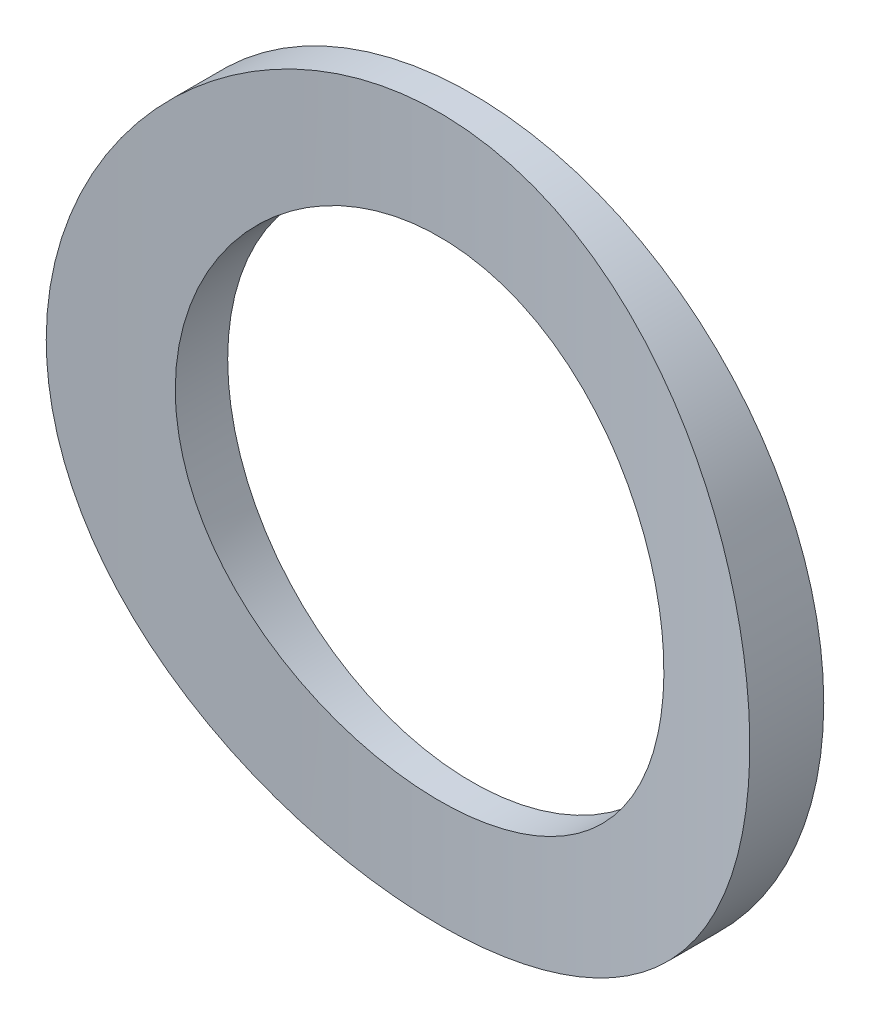
ISO-10303-21;
HEADER;
FILE_DESCRIPTION(('STEP AP214'),'2;1');
FILE_NAME('part.step','',(''),(''),'','','');
FILE_SCHEMA(('AUTOMOTIVE_DESIGN { 1 0 10303 214 1 1 1 1 }'));
ENDSEC;
DATA;
#1=APPLICATION_CONTEXT('core data for automotive mechanical design processes');
#2=APPLICATION_PROTOCOL_DEFINITION('international standard','automotive_design',2000,#1);
#3=PRODUCT_CONTEXT('',#1,'mechanical');
#4=PRODUCT('Part','Part','',(#3));
#5=PRODUCT_RELATED_PRODUCT_CATEGORY('part','',(#4));
#6=PRODUCT_DEFINITION_FORMATION('','',#4);
#7=PRODUCT_DEFINITION_CONTEXT('part definition',#1,'design');
#8=PRODUCT_DEFINITION('design','',#6,#7);
#9=PRODUCT_DEFINITION_SHAPE('','',#8);
#10=(LENGTH_UNIT() NAMED_UNIT(*) SI_UNIT(.MILLI.,.METRE.));
#11=(NAMED_UNIT(*) PLANE_ANGLE_UNIT() SI_UNIT($,.RADIAN.));
#12=(NAMED_UNIT(*) SI_UNIT($,.STERADIAN.) SOLID_ANGLE_UNIT());
#13=UNCERTAINTY_MEASURE_WITH_UNIT(LENGTH_MEASURE(1.E-05),#10,'distance_accuracy_value','');
#14=(GEOMETRIC_REPRESENTATION_CONTEXT(3) GLOBAL_UNCERTAINTY_ASSIGNED_CONTEXT((#13)) GLOBAL_UNIT_ASSIGNED_CONTEXT((#10,
#11,#12)) REPRESENTATION_CONTEXT('',''));
#15=CARTESIAN_POINT('',(0.,0.,0.));
#16=DIRECTION('',(0.,0.,1.));
#17=DIRECTION('',(1.,0.,0.));
#18=AXIS2_PLACEMENT_3D('',#15,#16,#17);
#19=CARTESIAN_POINT('',(0.,0.,0.));
#20=DIRECTION('',(0.,0.,1.));
#21=DIRECTION('',(1.,0.,0.));
#22=AXIS2_PLACEMENT_3D('',#19,#20,#21);
#23=PLANE('',#22);
#24=CARTESIAN_POINT('',(0.,0.,0.));
#25=DIRECTION('',(0.,0.,1.));
#26=DIRECTION('',(1.,0.,0.));
#27=AXIS2_PLACEMENT_3D('',#24,#25,#26);
#28=CIRCLE('',#27,10.8);
#29=CARTESIAN_POINT('',(10.8,0.,0.));
#30=VERTEX_POINT('',#29);
#31=EDGE_CURVE('E10',#30,#30,#28,.T.);
#32=ORIENTED_EDGE('',*,*,#31,.F.);
#33=EDGE_LOOP('',(#32));
#34=FACE_BOUND('',#33,.T.);
#35=CARTESIAN_POINT('',(0.,0.,0.));
#36=DIRECTION('',(0.,0.,1.));
#37=DIRECTION('',(1.,0.,0.));
#38=AXIS2_PLACEMENT_3D('',#35,#36,#37);
#39=CIRCLE('',#38,7.5);
#40=CARTESIAN_POINT('',(7.5,0.,0.));
#41=VERTEX_POINT('',#40);
#42=EDGE_CURVE('E45',#41,#41,#39,.T.);
#43=ORIENTED_EDGE('',*,*,#42,.T.);
#44=EDGE_LOOP('',(#43));
#45=FACE_BOUND('',#44,.T.);
#46=ADVANCED_FACE('F31',(#34,#45),#23,.F.);
#47=CARTESIAN_POINT('',(0.,0.,30.));
#48=DIRECTION('',(0.,0.,-1.));
#49=DIRECTION('',(-1.,0.,0.));
#50=AXIS2_PLACEMENT_3D('',#47,#48,#49);
#51=CYLINDRICAL_SURFACE('',#50,10.8);
#52=CARTESIAN_POINT('',(-10.8,0.,2.27073685973223));
#53=CARTESIAN_POINT('',(-10.8000077639499,0.299001355064548,2.27074173485695));
#54=CARTESIAN_POINT('',(-10.7875806288362,0.597913848239931,2.26776868920434));
#55=CARTESIAN_POINT('',(-10.7379924634883,1.19365056032112,2.25597722948887));
#56=CARTESIAN_POINT('',(-10.7008280778157,1.49047449040715,2.24715802243497));
#57=CARTESIAN_POINT('',(-10.6020355743017,2.07995969588069,2.22392653979849));
#58=CARTESIAN_POINT('',(-10.5403934990447,2.37261849747889,2.20951107327967));
#59=CARTESIAN_POINT('',(-10.3931508046333,2.95154555763004,2.17551816349824));
#60=CARTESIAN_POINT('',(-10.3075496318456,3.23781366834545,2.15594060095345));
#61=CARTESIAN_POINT('',(-10.1131844935509,3.8016193982467,2.11222486629569));
#62=CARTESIAN_POINT('',(-10.0044487912071,4.07916720032196,2.08809226304185));
#63=CARTESIAN_POINT('',(-9.76457767262258,4.6240271944064,2.03594569402156));
#64=CARTESIAN_POINT('',(-9.63344210524146,4.89133931733662,2.00793170206613));
#65=CARTESIAN_POINT('',(-9.34975164690604,5.413919290342,1.94881942597762));
#66=CARTESIAN_POINT('',(-9.19720070235002,5.66918934796009,1.9177217104185));
#67=CARTESIAN_POINT('',(-8.87167256651769,6.16617371385794,1.85328980358992));
#68=CARTESIAN_POINT('',(-8.69868862738671,6.4078835048667,1.81995487507465));
#69=CARTESIAN_POINT('',(-8.33040148872024,6.88008530329421,1.75139173384846));
#70=CARTESIAN_POINT('',(-8.13476988222033,7.11031796814008,1.71614101672734));
#71=CARTESIAN_POINT('',(-7.72494638698721,7.55356282311963,1.64526030330282));
#72=CARTESIAN_POINT('',(-7.5107543275332,7.76657485482147,1.60963030351338));
#73=CARTESIAN_POINT('',(-7.06517177307179,8.17401416550872,1.53896682166821));
#74=CARTESIAN_POINT('',(-6.83377682753116,8.36843660525884,1.50393349687881));
#75=CARTESIAN_POINT('',(-6.35544637869229,8.73724640441633,1.43544996569935));
#76=CARTESIAN_POINT('',(-6.10851635390818,8.91164076619035,1.40199920842029));
#77=CARTESIAN_POINT('',(-5.59759039681111,9.24123994407877,1.33719775122637));
#78=CARTESIAN_POINT('',(-5.33342379114506,9.39618633874338,1.30587744590513));
#79=CARTESIAN_POINT('',(-4.79257862951301,9.68322861499183,1.24667596206648));
#80=CARTESIAN_POINT('',(-4.51589994343713,9.81532425888771,1.21879481932327));
#81=CARTESIAN_POINT('',(-3.95200211876164,10.0556252571342,1.16727014628905));
#82=CARTESIAN_POINT('',(-3.66478401485985,10.1638329493838,1.14362620134878));
#83=CARTESIAN_POINT('',(-3.0818520701601,10.3554969991431,1.10125379368034));
#84=CARTESIAN_POINT('',(-2.78613839843994,10.4389538488674,1.08252523320184));
#85=CARTESIAN_POINT('',(-2.19364856046447,10.5791752518373,1.05080825232496));
#86=CARTESIAN_POINT('',(-1.89698233982591,10.6363830030558,1.03772476399887));
#87=CARTESIAN_POINT('',(-1.29970821189884,10.7257603705992,1.01719596870116));
#88=CARTESIAN_POINT('',(-0.999100346340561,10.7579302517831,1.00975060208765));
#89=CARTESIAN_POINT('',(-0.39619185150779,10.7969568897382,1.00071012076971));
#90=CARTESIAN_POINT('',(-0.0938914154250195,10.8038164787512,0.999114351490847));
#91=CARTESIAN_POINT('',(0.510192286693852,10.7921714260572,1.00181680734435));
#92=CARTESIAN_POINT('',(0.811975558189172,10.7736670537656,1.0061149698715));
#93=CARTESIAN_POINT('',(1.4070249154036,10.7120507666735,1.02034446740681));
#94=CARTESIAN_POINT('',(1.70034334894591,10.6694175826488,1.03016618824462));
#95=CARTESIAN_POINT('',(2.28226432163627,10.5602511887253,1.05509296166088));
#96=CARTESIAN_POINT('',(2.57086693119371,10.493718336001,1.07019793528238));
#97=CARTESIAN_POINT('',(3.1413676121023,10.3372772360708,1.10528249033795));
#98=CARTESIAN_POINT('',(3.42326547614662,10.2473682671119,1.12526222228223));
#99=CARTESIAN_POINT('',(3.97843958455759,10.0448657694457,1.16955916960642));
#100=CARTESIAN_POINT('',(4.25171572067711,9.9322719560576,1.19387643941931));
#101=CARTESIAN_POINT('',(4.7899411414532,9.68426307355597,1.24640619014612));
#102=CARTESIAN_POINT('',(5.05480820518093,9.54867577055802,1.27464775420484));
#103=CARTESIAN_POINT('',(5.57230079550226,9.25623194795598,1.33413184115315));
#104=CARTESIAN_POINT('',(5.82492172599082,9.09936752543654,1.3653754778328));
#105=CARTESIAN_POINT('',(6.31612038327397,8.76554491510718,1.43001214795264));
#106=CARTESIAN_POINT('',(6.55470200235186,8.58859233680415,1.46340458023083));
#107=CARTESIAN_POINT('',(7.01648308314049,8.21566115439298,1.53147425328785));
#108=CARTESIAN_POINT('',(7.23967543823556,8.01967385952755,1.56615207643233));
#109=CARTESIAN_POINT('',(7.67417170073386,7.60521691313389,1.6366718844354));
#110=CARTESIAN_POINT('',(7.885074768365,7.38632822782758,1.67252211346239));
#111=CARTESIAN_POINT('',(8.28764619645418,6.93160097336108,1.74356539589387));
#112=CARTESIAN_POINT('',(8.47932293461083,6.69576986426533,1.77875873004543));
#113=CARTESIAN_POINT('',(8.84231396283838,6.2085276838628,1.84752486648222));
#114=CARTESIAN_POINT('',(9.01361881299769,5.95710947127149,1.88109691325011));
#115=CARTESIAN_POINT('',(9.33448162170863,5.4405749625447,1.94562620578148));
#116=CARTESIAN_POINT('',(9.4840480484064,5.17546405520439,1.97658446775773));
#117=CARTESIAN_POINT('',(9.76094860294546,4.63219138736338,2.03511129600823));
#118=CARTESIAN_POINT('',(9.88819356023803,4.35398267186326,2.06266614215835));
#119=CARTESIAN_POINT('',(10.1187422165277,3.78742511944371,2.11341822461911));
#120=CARTESIAN_POINT('',(10.2220457927394,3.49907623052823,2.13661543858114));
#121=CARTESIAN_POINT('',(10.403858304161,2.91435344383571,2.17794015685011));
#122=CARTESIAN_POINT('',(10.4823709170877,2.61798074347312,2.19606841308657));
#123=CARTESIAN_POINT('',(10.6139582928952,2.01935619320439,2.22669589501808));
#124=CARTESIAN_POINT('',(10.6670336239601,1.7171044747729,2.23919524644376));
#125=CARTESIAN_POINT('',(10.7463683867706,1.11596161352194,2.2579546698654));
#126=CARTESIAN_POINT('',(10.7732139459164,0.817151964280564,2.26435103788478));
#127=CARTESIAN_POINT('',(10.8019547382571,0.21826884368453,2.27120090385383));
#128=CARTESIAN_POINT('',(10.8038503502968,-0.0818046084110967,2.2716544920398));
#129=CARTESIAN_POINT('',(10.7826763638089,-0.680995772700239,2.26660522187478));
#130=CARTESIAN_POINT('',(10.7596085766466,-0.980113552658702,2.26110279569722));
#131=CARTESIAN_POINT('',(10.688706152298,-1.57523285989396,2.24430927363718));
#132=CARTESIAN_POINT('',(10.6408716002498,-1.87123439787956,2.23301819765375));
#133=CARTESIAN_POINT('',(10.521657118881,-2.45397020749674,2.20517990454867));
#134=CARTESIAN_POINT('',(10.4506082967894,-2.74077586345949,2.18870671670118));
#135=CARTESIAN_POINT('',(10.2853671547845,-3.30730830193704,2.15093767291708));
#136=CARTESIAN_POINT('',(10.1911751060527,-3.58703516735545,2.12964187348981));
#137=CARTESIAN_POINT('',(9.98037324428892,-4.13751253138689,2.0828362167096));
#138=CARTESIAN_POINT('',(9.86376542815623,-4.40826382706768,2.05732673475928));
#139=CARTESIAN_POINT('',(9.60893418676102,-4.93914061054789,2.00279650866618));
#140=CARTESIAN_POINT('',(9.47070309833926,-5.19926228989697,1.9737745205404));
#141=CARTESIAN_POINT('',(9.17109819416883,-5.71143289851947,1.91250749635933));
#142=CARTESIAN_POINT('',(9.00937123497992,-5.96326972224196,1.88021609636413));
#143=CARTESIAN_POINT('',(8.66571666953107,-6.4524971718311,1.8137351350688));
#144=CARTESIAN_POINT('',(8.48378868091327,-6.6898875241284,1.77954553784639));
#145=CARTESIAN_POINT('',(8.10090164085614,-7.14875572360928,1.710199209557));
#146=CARTESIAN_POINT('',(7.89993708861617,-7.37022893866756,1.67504220104207));
#147=CARTESIAN_POINT('',(7.48041176688554,-7.79568247777986,1.60473951038025));
#148=CARTESIAN_POINT('',(7.26185685249643,-7.99966857626292,1.56959382834207));
#149=CARTESIAN_POINT('',(6.80363948670826,-8.39306925401438,1.49950751174856));
#150=CARTESIAN_POINT('',(6.5636249738233,-8.58207769298749,1.46458742600922));
#151=CARTESIAN_POINT('',(6.06826033438221,-8.93920860569443,1.39671912576174));
#152=CARTESIAN_POINT('',(5.81290996466278,-9.10733074812815,1.36377094253637));
#153=CARTESIAN_POINT('',(5.28861646315812,-9.42146065805262,1.30077618740398));
#154=CARTESIAN_POINT('',(5.0196737488114,-9.56746910413389,1.27072952646983));
#155=CARTESIAN_POINT('',(4.4700488393126,-9.83627190631416,1.21438853895161));
#156=CARTESIAN_POINT('',(4.18936679811181,-9.95906656672574,1.18809416317944));
#157=CARTESIAN_POINT('',(3.62020509007169,-10.1797166971282,1.14017345303671));
#158=CARTESIAN_POINT('',(3.33179210643366,-10.2777374367694,1.11851633970043));
#159=CARTESIAN_POINT('',(2.74740320716056,-10.4491384575663,1.08025932883062));
#160=CARTESIAN_POINT('',(2.45142730800213,-10.5225187923991,1.06365942028042));
#161=CARTESIAN_POINT('',(1.85412052524956,-10.6440174820748,1.0359949591215));
#162=CARTESIAN_POINT('',(1.55279038424757,-10.692139312238,1.02492964501726));
#163=CARTESIAN_POINT('',(0.94698446975415,-10.7627232060693,1.00865085127562));
#164=CARTESIAN_POINT('',(0.64250875470349,-10.7851857455925,1.00343726311718));
#165=CARTESIAN_POINT('',(0.0398432814240538,-10.8040348604173,0.999064134811235));
#166=CARTESIAN_POINT('',(-0.258326946408867,-10.801019008931,0.99976585545011));
#167=CARTESIAN_POINT('',(-0.853325982441433,-10.7703561851977,1.00687403452547));
#168=CARTESIAN_POINT('',(-1.15015481289775,-10.7427096231466,1.01328039795775));
#169=CARTESIAN_POINT('',(-1.74033440604452,-10.6630155940839,1.03162044019156));
#170=CARTESIAN_POINT('',(-2.03368526543595,-10.6109688071315,1.04355396494537));
#171=CARTESIAN_POINT('',(-2.61484116715757,-10.4828976474921,1.07261997863682));
#172=CARTESIAN_POINT('',(-2.9026461853381,-10.406873170418,1.0897524902083));
#173=CARTESIAN_POINT('',(-3.46954986514981,-10.231806994261,1.12866889999212));
#174=CARTESIAN_POINT('',(-3.74867922770274,-10.1328603591127,1.1504335580266));
#175=CARTESIAN_POINT('',(-4.29757077324849,-9.91253464627897,1.19807060180087));
#176=CARTESIAN_POINT('',(-4.56733300618388,-9.79115568821741,1.22394296563558));
#177=CARTESIAN_POINT('',(-5.09569261012037,-9.52686532689198,1.27910410254422));
#178=CARTESIAN_POINT('',(-5.35429108236778,-9.38395605375353,1.30839253758073));
#179=CARTESIAN_POINT('',(-5.85878409812715,-9.07754293770508,1.36962575052546));
#180=CARTESIAN_POINT('',(-6.10467376346153,-8.91403126830648,1.4015715363391));
#181=CARTESIAN_POINT('',(-6.58702894054109,-8.56397547126851,1.46795006381996));
#182=CARTESIAN_POINT('',(-6.82319443338545,-8.37702498539523,1.50242057191657));
#183=CARTESIAN_POINT('',(-7.2791181395949,-7.98405016617387,1.57231767317527));
#184=CARTESIAN_POINT('',(-7.49886881138631,-7.77801716180381,1.60774469574229));
#185=CARTESIAN_POINT('',(-7.9204540320696,-7.34826734742555,1.67857670816378));
#186=CARTESIAN_POINT('',(-8.12228424747045,-7.12454628471618,1.71398169064434));
#187=CARTESIAN_POINT('',(-8.50653654650244,-6.66103745404264,1.78376670422447));
#188=CARTESIAN_POINT('',(-8.68896725300596,-6.42125690224647,1.81814718577099));
#189=CARTESIAN_POINT('',(-9.03602461915932,-5.92316232107334,1.88547224134056));
#190=CARTESIAN_POINT('',(-9.20032108478571,-5.66461377168659,1.91838518667168));
#191=CARTESIAN_POINT('',(-9.50644212531237,-5.13432183367143,1.98120339364239));
#192=CARTESIAN_POINT('',(-9.64827508425109,-4.86258341759471,2.01110977588998));
#193=CARTESIAN_POINT('',(-9.90840033447303,-4.30782805727641,2.06702364321712));
#194=CARTESIAN_POINT('',(-10.0267044935464,-4.02481688585461,2.09303309224584));
#195=CARTESIAN_POINT('',(-10.238895010355,-3.44950426917343,2.14037896803993));
#196=CARTESIAN_POINT('',(-10.332785480953,-3.1572043980621,2.16171618181975));
#197=CARTESIAN_POINT('',(-10.5417658985946,-2.39649048078917,2.20970004636744));
#198=CARTESIAN_POINT('',(-10.6384487404986,-1.92263358242326,2.23244376273321));
#199=CARTESIAN_POINT('',(-10.7675575287576,-0.965773522841456,2.26295776891854));
#200=CARTESIAN_POINT('',(-10.7999874642396,-0.482770931313611,2.27072898830135));
#201=CARTESIAN_POINT('',(-10.8,0.,2.27073685973223));
#202=B_SPLINE_CURVE_WITH_KNOTS('',3,(#52,#53,#54,#55,#56,#57,#58,#59,#60,#61,#62,#63,#64,#65,
#66,#67,#68,#69,#70,#71,#72,#73,#74,#75,#76,#77,#78,#79,#80,#81,#82,#83,#84,#85,#86,#87,#88,#89,
#90,#91,#92,#93,#94,#95,#96,#97,#98,#99,#100,#101,#102,#103,#104,#105,#106,#107,#108,#109,#110,
#111,#112,#113,#114,#115,#116,#117,#118,#119,#120,#121,#122,#123,#124,#125,#126,#127,#128,#129,
#130,#131,#132,#133,#134,#135,#136,#137,#138,#139,#140,#141,#142,#143,#144,#145,#146,#147,#148,
#149,#150,#151,#152,#153,#154,#155,#156,#157,#158,#159,#160,#161,#162,#163,#164,#165,#166,#167,
#168,#169,#170,#171,#172,#173,#174,#175,#176,#177,#178,#179,#180,#181,#182,#183,#184,#185,#186,
#187,#188,#189,#190,#191,#192,#193,#194,#195,#196,#197,#198,#199,#200,#201),.UNSPECIFIED.,.T.,
.F.,(4,2,2,2,2,2,2,2,2,2,2,2,2,2,2,2,2,2,2,2,2,2,2,2,2,2,2,2,2,2,2,2,2,2,2,2,2,2,2,2,2,2,2,2,2,
2,2,2,2,2,2,2,2,2,2,2,2,2,2,2,2,2,2,2,2,2,2,2,2,2,2,2,2,2,4),(0.,0.896578405721219,
1.79327845094476,2.69049053912472,3.58772336128606,4.48386627578531,5.38001523714484,
6.27599927357424,7.17228003415443,8.08374154655448,8.99521144355307,9.90691797169745,
10.8183047654578,11.7407463858677,12.6631976007148,13.5855584957716,14.50790104681,
15.4140388986039,16.3201671648391,17.2261940315266,18.1322112744914,19.020852865191,
19.9094811759218,20.7981369268981,21.6868038306505,22.5824478391688,23.4784254304734,
24.374153437566,25.2702923507597,26.1874185213981,27.1041433105711,28.0212912493796,
28.9380809524958,29.8584535668097,30.778830901232,31.6990716343004,32.619291811293,
33.5184436051873,34.4175817461714,35.3166546493076,36.2157244618151,37.1024930243816,
37.9892511967036,38.8759304091198,39.7629245702776,40.6649815641894,41.5670556348243,
42.4693911683586,43.3714275842252,44.2928021095853,45.2141912479958,46.1355521065269,
47.0569008859796,47.9719305808206,48.8869582823377,49.8018600520804,50.7167448545665,
51.6102324944427,52.503705254598,53.3971531142383,54.2906048635669,55.1804155580846,
56.0702215076843,56.9599394810943,57.8499964675569,58.75845845339,59.6673352852251,
60.5764313047485,61.4851215368259,62.4082980172299,63.3311291250223,64.2534935750377,
65.1757025376969,66.6234179409925,68.0710434603894),.UNSPECIFIED.);
#203=CARTESIAN_POINT('',(-10.8,0.,2.27073685973223));
#204=VERTEX_POINT('',#203);
#205=EDGE_CURVE('E49',#204,#204,#202,.T.);
#206=ORIENTED_EDGE('',*,*,#205,.T.);
#207=EDGE_LOOP('',(#206));
#208=FACE_BOUND('',#207,.T.);
#209=ORIENTED_EDGE('',*,*,#31,.T.);
#210=EDGE_LOOP('',(#209));
#211=FACE_BOUND('',#210,.T.);
#212=ADVANCED_FACE('F33',(#208,#211),#51,.T.);
#213=CARTESIAN_POINT('',(0.,0.,30.));
#214=DIRECTION('',(0.,0.,-1.));
#215=DIRECTION('',(-1.,0.,0.));
#216=AXIS2_PLACEMENT_3D('',#213,#214,#215);
#217=CYLINDRICAL_SURFACE('',#216,7.5);
#218=CARTESIAN_POINT('',(-7.5,0.,1.60842663845237));
#219=CARTESIAN_POINT('',(-7.50000310004231,0.209237951355892,1.60842800898571));
#220=CARTESIAN_POINT('',(-7.49124110676116,0.418433500386381,1.6069937772954));
#221=CARTESIAN_POINT('',(-7.45626487777193,0.835386596699285,1.60130147611473));
#222=CARTESIAN_POINT('',(-7.43004711016824,1.04314384436721,1.59704283515119));
#223=CARTESIAN_POINT('',(-7.36033143969776,1.45579640713422,1.58582017015627));
#224=CARTESIAN_POINT('',(-7.31682231470485,1.66068977399716,1.57885438925059));
#225=CARTESIAN_POINT('',(-7.21283756659006,2.06610291384546,1.56241746605274));
#226=CARTESIAN_POINT('',(-7.15235571556807,2.2666210522401,1.55294540418947));
#227=CARTESIAN_POINT('',(-7.01496772818524,2.66155776946498,1.53178321018825));
#228=CARTESIAN_POINT('',(-6.93808125445849,2.85598333370477,1.52009573530652));
#229=CARTESIAN_POINT('',(-6.76837429397757,3.2377081833336,1.4948246770211));
#230=CARTESIAN_POINT('',(-6.67554793475428,3.42500481114742,1.48124039515396));
#231=CARTESIAN_POINT('',(-6.47469886519898,3.79101965602639,1.45257109618812));
#232=CARTESIAN_POINT('',(-6.36668380888356,3.96974213338235,1.4374868360854));
#233=CARTESIAN_POINT('',(-6.13614000914509,4.31756120255392,1.4062293709947));
#234=CARTESIAN_POINT('',(-6.01360587234313,4.48665418256367,1.39005576231708));
#235=CARTESIAN_POINT('',(-5.75388205393554,4.81529349568494,1.35694499668998));
#236=CARTESIAN_POINT('',(-5.61658435085905,4.97475396281579,1.34000282149732));
#237=CARTESIAN_POINT('',(-5.32903802376743,5.28162701871979,1.30594548270838));
#238=CARTESIAN_POINT('',(-5.17878462417377,5.42903512554874,1.28883025739415));
#239=CARTESIAN_POINT('',(-4.86645216374103,5.71067842010067,1.25491810004372));
#240=CARTESIAN_POINT('',(-4.70437677141312,5.84491766421994,1.23812107128817));
#241=CARTESIAN_POINT('',(-4.36940872433828,6.09938712019816,1.20530364772709));
#242=CARTESIAN_POINT('',(-4.19651210341498,6.21961214883118,1.18928354154135));
#243=CARTESIAN_POINT('',(-3.84018309784239,6.44575525699546,1.15839186728666));
#244=CARTESIAN_POINT('',(-3.65669885223262,6.55159255613364,1.1435269699185));
#245=CARTESIAN_POINT('',(-3.2813340984787,6.74741863924646,1.11546388267449));
#246=CARTESIAN_POINT('',(-3.0894535176413,6.83740728597379,1.10226570723252));
#247=CARTESIAN_POINT('',(-2.69866596019677,7.00086113571623,1.07791262546506));
#248=CARTESIAN_POINT('',(-2.49975941090208,7.07432734161463,1.06675759513186));
#249=CARTESIAN_POINT('',(-2.09632895752328,7.20418699670608,1.04680852109991));
#250=CARTESIAN_POINT('',(-1.89180497525732,7.26058020815052,1.03801451027955));
#251=CARTESIAN_POINT('',(-1.48044821477849,7.35543538990898,1.02310640053227));
#252=CARTESIAN_POINT('',(-1.27365176529438,7.39405128343834,1.01696932553996));
#253=CARTESIAN_POINT('',(-0.857414992491751,7.45379551278308,1.00743450565046));
#254=CARTESIAN_POINT('',(-0.647973780827537,7.47491780503055,1.00403770745558));
#255=CARTESIAN_POINT('',(-0.228103341470235,7.49947663693933,1.00008612709181));
#256=CARTESIAN_POINT('',(-0.0176745630749211,7.50292056118977,0.999530158255136));
#257=CARTESIAN_POINT('',(0.402738924883321,7.49213614077099,1.00126650568137));
#258=CARTESIAN_POINT('',(0.612723442564314,7.47790129319955,1.00355987003391));
#259=CARTESIAN_POINT('',(1.23567702723121,7.4091901382021,1.01457793325708));
#260=CARTESIAN_POINT('',(1.6460463624496,7.32895691244866,1.02740144898877));
#261=CARTESIAN_POINT('',(2.44719093407735,7.1017536885861,1.06266250453943));
#262=CARTESIAN_POINT('',(2.83796560400835,6.9547817623065,1.08510032212741));
#263=CARTESIAN_POINT('',(3.5910650250218,6.59761903950575,1.13723938945999));
#264=CARTESIAN_POINT('',(3.95325988641284,6.38715847748296,1.16697153033906));
#265=CARTESIAN_POINT('',(4.63742119066314,5.9091905189663,1.23039415180955));
#266=CARTESIAN_POINT('',(4.95938458070221,5.64167879751471,1.26408493241216));
#267=CARTESIAN_POINT('',(5.55780154004595,5.05359202057368,1.33212533607814));
#268=CARTESIAN_POINT('',(5.8336970737303,4.73244913728612,1.36647809682667));
#269=CARTESIAN_POINT('',(6.32777266974111,4.04813476577568,1.43159988867525));
#270=CARTESIAN_POINT('',(6.54595226419974,3.68496293688413,1.46236889072282));
#271=CARTESIAN_POINT('',(6.91850222578428,2.92627487637723,1.51684013919002));
#272=CARTESIAN_POINT('',(7.0728087476292,2.5307267531669,1.54053530829253));
#273=CARTESIAN_POINT('',(7.31263602420977,1.71885895863071,1.5780562890935));
#274=CARTESIAN_POINT('',(7.39816242088142,1.30254099400136,1.59188291028447));
#275=CARTESIAN_POINT('',(7.49722322877017,0.465935337878749,1.60794571041301));
#276=CARTESIAN_POINT('',(7.51155168543268,0.0457440389728116,1.61030972057218));
#277=CARTESIAN_POINT('',(7.46992155580746,-0.791035608138519,1.60351964872926));
#278=CARTESIAN_POINT('',(7.41396550160588,-1.2076240855956,1.59436598166565));
#279=CARTESIAN_POINT('',(7.23403515934158,-2.0228684847523,1.56569017611544));
#280=CARTESIAN_POINT('',(7.11046210846825,-2.42161532419862,1.54622922238278));
#281=CARTESIAN_POINT('',(6.79920815403392,-3.19274779078062,1.49918131817801));
#282=CARTESIAN_POINT('',(6.61152364007083,-3.56513193188923,1.47159391008111));
#283=CARTESIAN_POINT('',(6.1755526496068,-4.27646833839519,1.4111080072606));
#284=CARTESIAN_POINT('',(5.9267560063621,-4.61510355341396,1.37816563556119));
#285=CARTESIAN_POINT('',(5.37608704649669,-5.24622185909425,1.31079269574547));
#286=CARTESIAN_POINT('',(5.07421124707305,-5.53870191888198,1.27636203008623));
#287=CARTESIAN_POINT('',(4.58666753875807,-5.93779344670591,1.22632218405291));
#288=CARTESIAN_POINT('',(4.41737272911676,-6.06478529203406,1.20982680048067));
#289=CARTESIAN_POINT('',(4.06861316953476,-6.30404825776702,1.17789232021576));
#290=CARTESIAN_POINT('',(3.88915219735134,-6.41632479566666,1.16245283579661));
#291=CARTESIAN_POINT('',(3.52123739902693,-6.62538237980837,1.13306190127671));
#292=CARTESIAN_POINT('',(3.33278049740363,-6.72215807673634,1.11911096542366));
#293=CARTESIAN_POINT('',(2.94831356412793,-6.89943718233463,1.0931025375171));
#294=CARTESIAN_POINT('',(2.75230627939405,-6.97994644358322,1.08104436480693));
#295=CARTESIAN_POINT('',(2.35486424702565,-7.12384063309937,1.05920310721771));
#296=CARTESIAN_POINT('',(2.15345415859282,-7.1872923301735,1.04941117313514));
#297=CARTESIAN_POINT('',(1.74590581248034,-7.29700923448904,1.03231936664989));
#298=CARTESIAN_POINT('',(1.53976766688406,-7.34327484869775,1.02501943523678));
#299=CARTESIAN_POINT('',(1.12425688663436,-7.41826210307088,1.01311983734737));
#300=CARTESIAN_POINT('',(0.914884400205263,-7.44698454477791,1.00852004750273));
#301=CARTESIAN_POINT('',(0.49442371027933,-7.48666372514549,1.00215190199507));
#302=CARTESIAN_POINT('',(0.28333554759477,-7.49762088516835,1.00038347917685));
#303=CARTESIAN_POINT('',(-0.136658398308484,-7.50166214243637,0.999732084446599));
#304=CARTESIAN_POINT('',(-0.345562252970785,-7.4949442952369,1.00081713811944));
#305=CARTESIAN_POINT('',(-0.761974935935828,-7.46411187087379,1.00577367457333));
#306=CARTESIAN_POINT('',(-0.9694842302383,-7.44000342982862,1.00964417453297));
#307=CARTESIAN_POINT('',(-1.38173956076028,-7.37457542635957,1.02006319616186));
#308=CARTESIAN_POINT('',(-1.58648510660041,-7.33325284997239,1.0266121867951));
#309=CARTESIAN_POINT('',(-1.9917239822067,-7.23371044773599,1.04220532950506));
#310=CARTESIAN_POINT('',(-2.19221739717022,-7.17549096078376,1.05124943153779));
#311=CARTESIAN_POINT('',(-2.5873602649559,-7.04265369355763,1.07157158501977));
#312=CARTESIAN_POINT('',(-2.78201521342178,-6.96805192176589,1.08284745457056));
#313=CARTESIAN_POINT('',(-3.16433939899122,-6.8029635391009,1.10732716158932));
#314=CARTESIAN_POINT('',(-3.35200868006384,-6.71247702822959,1.12053098691981));
#315=CARTESIAN_POINT('',(-3.71912096370475,-6.51624647644735,1.14850649178975));
#316=CARTESIAN_POINT('',(-3.89856221770274,-6.41049921203465,1.16327850239945));
#317=CARTESIAN_POINT('',(-4.24790072250307,-6.18454511375454,1.19397751682759));
#318=CARTESIAN_POINT('',(-4.41780131133168,-6.0643433839474,1.20990411216273));
#319=CARTESIAN_POINT('',(-4.74881869104874,-5.80886524139034,1.24266270224952));
#320=CARTESIAN_POINT('',(-4.90981679948783,-5.67343606394801,1.25950279554646));
#321=CARTESIAN_POINT('',(-5.21980062981579,-5.38960378688382,1.29344638811595));
#322=CARTESIAN_POINT('',(-5.36879063053386,-5.2412053482164,1.31054979095336));
#323=CARTESIAN_POINT('',(-5.65388522721367,-4.9323199478784,1.34455738969216));
#324=CARTESIAN_POINT('',(-5.78998203866294,-4.77182578685183,1.36146145991834));
#325=CARTESIAN_POINT('',(-6.0481961841559,-4.43998925528021,1.39457797302038));
#326=CARTESIAN_POINT('',(-6.17031865633387,-4.26865090818541,1.41079066871885));
#327=CARTESIAN_POINT('',(-6.40058235713033,-3.91501879587563,1.44218113684149));
#328=CARTESIAN_POINT('',(-6.50862035880502,-3.73265707993564,1.45735092069563));
#329=CARTESIAN_POINT('',(-6.70888655604382,-3.35941673244407,1.48608644826373));
#330=CARTESIAN_POINT('',(-6.80112056650648,-3.16854126614981,1.49965278137671));
#331=CARTESIAN_POINT('',(-6.96908490733807,-2.77968882712478,1.52478321645335));
#332=CARTESIAN_POINT('',(-7.04482694252418,-2.5817170078596,1.5363487372438));
#333=CARTESIAN_POINT('',(-7.17929974939744,-2.18002845423169,1.55714747000574));
#334=CARTESIAN_POINT('',(-7.23803423159651,-1.97631298361149,1.56638119064621));
#335=CARTESIAN_POINT('',(-7.35831914159265,-1.48111216190531,1.58545515614885));
#336=CARTESIAN_POINT('',(-7.41138750977102,-1.18747476310035,1.59402823366019));
#337=CARTESIAN_POINT('',(-7.48222544501951,-0.595862881052989,1.60551295314404));
#338=CARTESIAN_POINT('',(-7.49999558652315,-0.297888468469436,1.60842468724766));
#339=CARTESIAN_POINT('',(-7.5,0.,1.60842663845237));
#340=B_SPLINE_CURVE_WITH_KNOTS('',3,(#218,#219,#220,#221,#222,#223,#224,#225,#226,#227,#228,
#229,#230,#231,#232,#233,#234,#235,#236,#237,#238,#239,#240,#241,#242,#243,#244,#245,#246,#247,
#248,#249,#250,#251,#252,#253,#254,#255,#256,#257,#258,#259,#260,#261,#262,#263,#264,#265,#266,
#267,#268,#269,#270,#271,#272,#273,#274,#275,#276,#277,#278,#279,#280,#281,#282,#283,#284,#285,
#286,#287,#288,#289,#290,#291,#292,#293,#294,#295,#296,#297,#298,#299,#300,#301,#302,#303,#304,
#305,#306,#307,#308,#309,#310,#311,#312,#313,#314,#315,#316,#317,#318,#319,#320,#321,#322,#323,
#324,#325,#326,#327,#328,#329,#330,#331,#332,#333,#334,#335,#336,#337,#338,#339),.UNSPECIFIED.,
.T.,.F.,(4,2,2,2,2,2,2,2,2,2,2,2,2,2,2,2,2,2,2,2,2,2,2,2,2,2,2,2,2,2,2,2,2,2,2,2,2,2,2,2,2,2,2,
2,2,2,2,2,2,2,2,2,2,2,2,2,2,2,2,2,4),(0.,0.6274526912871,1.25503237614664,1.88302002838325,
2.51123841372906,3.13870800259098,3.76640925764263,4.39379532226804,5.02141517593143,
5.653987800254,6.28679460118808,6.91940586293599,7.55225036160841,8.1885129142707,
8.82478097661462,9.46101040816878,10.0972486990768,10.7278694840182,11.3587080406792,
11.9892830626718,12.6200901020542,13.8686506119501,15.1172471967274,16.3712256829529,
17.6252992651071,18.8936071291305,20.1619252742352,21.4315081419718,22.7009868570029,
23.9562752419134,25.2115184048093,26.4593925211205,27.7073369223704,28.9660761034476,
30.2248979078726,30.8610933450563,31.4970539026567,32.1332334585084,32.7691837110773,
33.4026071539603,34.0360155963883,34.6693950963981,35.3027595735017,35.92905725368,
36.5551340582411,37.1813205265229,37.8074944364117,38.4330591615819,39.0586199486683,
39.6843130657765,40.3097858877076,40.9422138509561,41.574415456612,42.2069963654827,
42.839343932298,43.4760927059522,44.1126066897013,44.7486674383885,45.3845893139384,
46.2778974439596,47.1711910364141),.UNSPECIFIED.);
#341=CARTESIAN_POINT('',(-7.5,0.,1.60842663845237));
#342=VERTEX_POINT('',#341);
#343=EDGE_CURVE('E36',#342,#342,#340,.T.);
#344=ORIENTED_EDGE('',*,*,#343,.F.);
#345=EDGE_LOOP('',(#344));
#346=FACE_BOUND('',#345,.T.);
#347=ORIENTED_EDGE('',*,*,#42,.F.);
#348=EDGE_LOOP('',(#347));
#349=FACE_BOUND('',#348,.T.);
#350=ADVANCED_FACE('F59',(#346,#349),#217,.F.);
#351=CARTESIAN_POINT('',(0.,-10.8,47.53));
#352=DIRECTION('',(0.,1.,0.));
#353=DIRECTION('',(0.,0.,1.));
#354=AXIS2_PLACEMENT_3D('',#351,#352,#353);
#355=CYLINDRICAL_SURFACE('',#354,46.53);
#356=ORIENTED_EDGE('',*,*,#343,.T.);
#357=EDGE_LOOP('',(#356));
#358=FACE_BOUND('',#357,.T.);
#359=ORIENTED_EDGE('',*,*,#205,.F.);
#360=EDGE_LOOP('',(#359));
#361=FACE_BOUND('',#360,.T.);
#362=ADVANCED_FACE('F56',(#358,#361),#355,.F.);
#363=CLOSED_SHELL('',(#46,#212,#350,#362));
#364=MANIFOLD_SOLID_BREP('B2',#363);
#365=ADVANCED_BREP_SHAPE_REPRESENTATION('',(#18,#364),#14);
#366=SHAPE_DEFINITION_REPRESENTATION(#9,#365);
ENDSEC;
END-ISO-10303-21;
